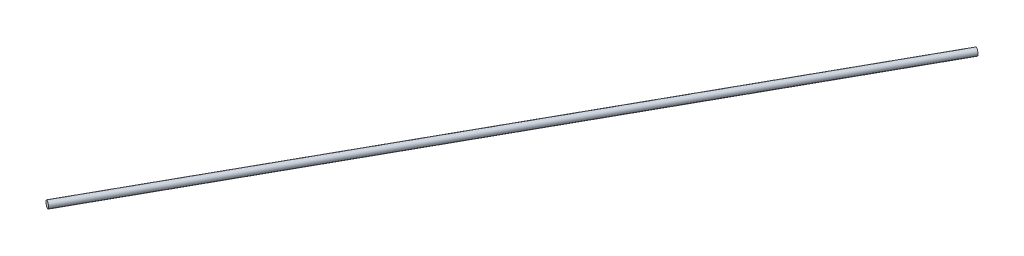
ISO-10303-21;
HEADER;
FILE_DESCRIPTION(('STEP AP214'),'2;1');
FILE_NAME('part.step','',(''),(''),'','','');
FILE_SCHEMA(('AUTOMOTIVE_DESIGN { 1 0 10303 214 1 1 1 1 }'));
ENDSEC;
DATA;
#1=APPLICATION_CONTEXT('core data for automotive mechanical design processes');
#2=APPLICATION_PROTOCOL_DEFINITION('international standard','automotive_design',2000,#1);
#3=PRODUCT_CONTEXT('',#1,'mechanical');
#4=PRODUCT('Part','Part','',(#3));
#5=PRODUCT_RELATED_PRODUCT_CATEGORY('part','',(#4));
#6=PRODUCT_DEFINITION_FORMATION('','',#4);
#7=PRODUCT_DEFINITION_CONTEXT('part definition',#1,'design');
#8=PRODUCT_DEFINITION('design','',#6,#7);
#9=PRODUCT_DEFINITION_SHAPE('','',#8);
#10=(LENGTH_UNIT() NAMED_UNIT(*) SI_UNIT(.MILLI.,.METRE.));
#11=(NAMED_UNIT(*) PLANE_ANGLE_UNIT() SI_UNIT($,.RADIAN.));
#12=(NAMED_UNIT(*) SI_UNIT($,.STERADIAN.) SOLID_ANGLE_UNIT());
#13=UNCERTAINTY_MEASURE_WITH_UNIT(LENGTH_MEASURE(1.E-05),#10,'distance_accuracy_value','');
#14=(GEOMETRIC_REPRESENTATION_CONTEXT(3) GLOBAL_UNCERTAINTY_ASSIGNED_CONTEXT((#13)) GLOBAL_UNIT_ASSIGNED_CONTEXT((#10,
#11,#12)) REPRESENTATION_CONTEXT('',''));
#15=CARTESIAN_POINT('',(0.,0.,0.));
#16=DIRECTION('',(0.,0.,1.));
#17=DIRECTION('',(1.,0.,0.));
#18=AXIS2_PLACEMENT_3D('',#15,#16,#17);
#19=CARTESIAN_POINT('',(205.39566397304,-850.,179.01635986214));
#20=DIRECTION('',(0.486263225815928,0.,-0.87381237987287));
#21=DIRECTION('',(0.,-1.,0.));
#22=AXIS2_PLACEMENT_3D('',#19,#20,#21);
#23=PLANE('',#22);
#24=CARTESIAN_POINT('',(205.39566397304,-850.,179.01635986214));
#25=DIRECTION('',(0.486263225815928,0.,-0.87381237987287));
#26=DIRECTION('',(-0.87381237987287,0.,-0.486263225815928));
#27=AXIS2_PLACEMENT_3D('',#24,#25,#26);
#28=CIRCLE('',#27,1.);
#29=CARTESIAN_POINT('',(204.52185159316,-850.,178.53009663633));
#30=VERTEX_POINT('',#29);
#31=EDGE_CURVE('E10',#30,#30,#28,.T.);
#32=ORIENTED_EDGE('',*,*,#31,.F.);
#33=EDGE_LOOP('',(#32));
#34=FACE_BOUND('',#33,.T.);
#35=ADVANCED_FACE('F15',(#34),#23,.F.);
#36=CARTESIAN_POINT('',(305.01553046316,-850.,0.));
#37=DIRECTION('',(0.486263225815928,0.,-0.87381237987287));
#38=DIRECTION('',(0.,-1.,0.));
#39=AXIS2_PLACEMENT_3D('',#36,#37,#38);
#40=PLANE('',#39);
#41=CARTESIAN_POINT('',(305.01553046316,-850.,0.));
#42=DIRECTION('',(0.486263225815928,0.,-0.87381237987287));
#43=DIRECTION('',(-0.87381237987287,0.,-0.486263225815928));
#44=AXIS2_PLACEMENT_3D('',#41,#42,#43);
#45=CIRCLE('',#44,1.);
#46=CARTESIAN_POINT('',(304.14171808329,-850.,-0.486263225816));
#47=VERTEX_POINT('',#46);
#48=EDGE_CURVE('E40',#47,#47,#45,.T.);
#49=ORIENTED_EDGE('',*,*,#48,.T.);
#50=EDGE_LOOP('',(#49));
#51=FACE_BOUND('',#50,.T.);
#52=ADVANCED_FACE('F17',(#51),#40,.T.);
#53=CARTESIAN_POINT('',(205.39566397304,-850.,179.01635986214));
#54=DIRECTION('',(0.486263225815928,0.,-0.87381237987287));
#55=DIRECTION('',(-0.87381237987287,0.,-0.486263225815928));
#56=AXIS2_PLACEMENT_3D('',#53,#54,#55);
#57=CYLINDRICAL_SURFACE('',#56,1.);
#58=ORIENTED_EDGE('',*,*,#48,.F.);
#59=DIRECTION('',(0.486263225815928,0.,-0.87381237987287));
#60=VECTOR('',#59,1.);
#61=CARTESIAN_POINT('',(204.52185159316,-850.,178.53009663633));
#62=LINE('',#61,#60);
#63=EDGE_CURVE('E19',#30,#47,#62,.T.);
#64=ORIENTED_EDGE('',*,*,#63,.F.);
#65=ORIENTED_EDGE('',*,*,#31,.T.);
#66=ORIENTED_EDGE('',*,*,#63,.T.);
#67=EDGE_LOOP('',(#58,#64,#65,#66));
#68=FACE_BOUND('',#67,.T.);
#69=ADVANCED_FACE('F39',(#68),#57,.T.);
#70=CLOSED_SHELL('',(#35,#52,#69));
#71=MANIFOLD_SOLID_BREP('B1',#70);
#72=ADVANCED_BREP_SHAPE_REPRESENTATION('',(#18,#71),#14);
#73=SHAPE_DEFINITION_REPRESENTATION(#9,#72);
ENDSEC;
END-ISO-10303-21;
